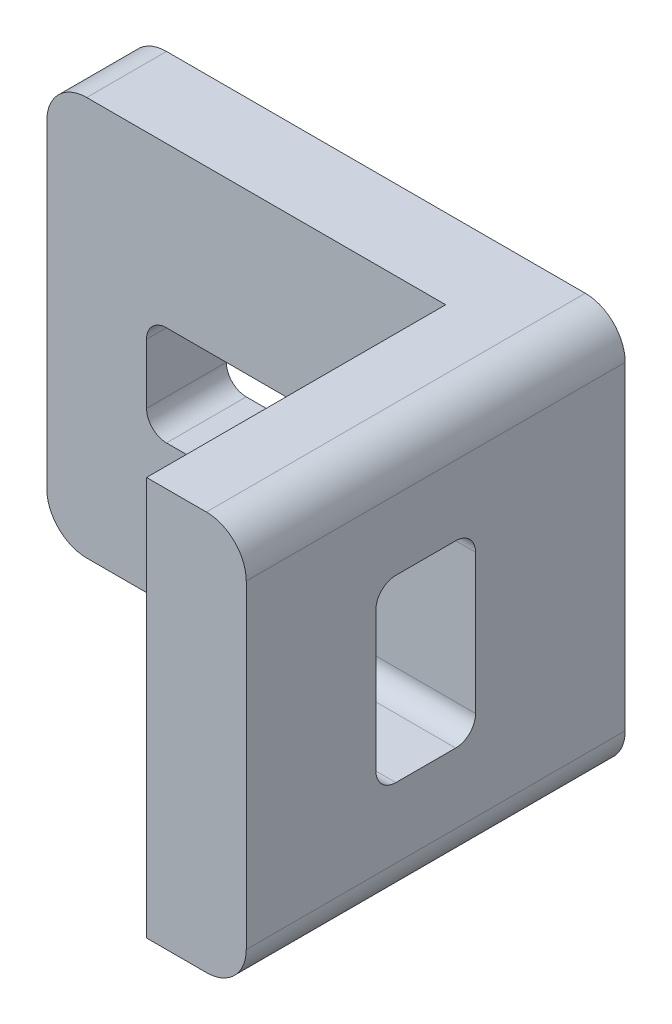
ISO-10303-21;
HEADER;
FILE_DESCRIPTION(('STEP AP214'),'2;1');
FILE_NAME('part.step','',(''),(''),'','','');
FILE_SCHEMA(('AUTOMOTIVE_DESIGN { 1 0 10303 214 1 1 1 1 }'));
ENDSEC;
DATA;
#1=APPLICATION_CONTEXT('core data for automotive mechanical design processes');
#2=APPLICATION_PROTOCOL_DEFINITION('international standard','automotive_design',2000,#1);
#3=PRODUCT_CONTEXT('',#1,'mechanical');
#4=PRODUCT('Part','Part','',(#3));
#5=PRODUCT_RELATED_PRODUCT_CATEGORY('part','',(#4));
#6=PRODUCT_DEFINITION_FORMATION('','',#4);
#7=PRODUCT_DEFINITION_CONTEXT('part definition',#1,'design');
#8=PRODUCT_DEFINITION('design','',#6,#7);
#9=PRODUCT_DEFINITION_SHAPE('','',#8);
#10=(LENGTH_UNIT() NAMED_UNIT(*) SI_UNIT(.MILLI.,.METRE.));
#11=(NAMED_UNIT(*) PLANE_ANGLE_UNIT() SI_UNIT($,.RADIAN.));
#12=(NAMED_UNIT(*) SI_UNIT($,.STERADIAN.) SOLID_ANGLE_UNIT());
#13=UNCERTAINTY_MEASURE_WITH_UNIT(LENGTH_MEASURE(1.E-05),#10,'distance_accuracy_value','');
#14=(GEOMETRIC_REPRESENTATION_CONTEXT(3) GLOBAL_UNCERTAINTY_ASSIGNED_CONTEXT((#13)) GLOBAL_UNIT_ASSIGNED_CONTEXT((#10,
#11,#12)) REPRESENTATION_CONTEXT('',''));
#15=CARTESIAN_POINT('',(0.,0.,0.));
#16=DIRECTION('',(0.,0.,1.));
#17=DIRECTION('',(1.,0.,0.));
#18=AXIS2_PLACEMENT_3D('',#15,#16,#17);
#19=CARTESIAN_POINT('',(9.72672672672673,6.70870870870871,4.));
#20=DIRECTION('',(0.,0.,-1.));
#21=DIRECTION('',(-1.,0.,0.));
#22=AXIS2_PLACEMENT_3D('',#19,#20,#21);
#23=PLANE('',#22);
#24=DIRECTION('',(0.,-1.,0.));
#25=VECTOR('',#24,1.);
#26=CARTESIAN_POINT('',(-8.27327327327327,-0.291291291291291,4.));
#27=LINE('',#26,#25);
#28=CARTESIAN_POINT('',(-8.27327327327327,-0.291291291291291,4.));
#29=VERTEX_POINT('',#28);
#30=CARTESIAN_POINT('',(-8.27327327327327,-3.29129129129129,4.));
#31=VERTEX_POINT('',#30);
#32=EDGE_CURVE('E277',#29,#31,#27,.T.);
#33=ORIENTED_EDGE('',*,*,#32,.F.);
#34=CARTESIAN_POINT('',(-7.27327327327327,-0.291291291291291,4.));
#35=DIRECTION('',(0.,0.,1.));
#36=DIRECTION('',(-1.,0.,0.));
#37=AXIS2_PLACEMENT_3D('',#34,#35,#36);
#38=CIRCLE('',#37,1.);
#39=CARTESIAN_POINT('',(-7.27327327327327,0.708708708708709,4.));
#40=VERTEX_POINT('',#39);
#41=EDGE_CURVE('E275',#40,#29,#38,.T.);
#42=ORIENTED_EDGE('',*,*,#41,.F.);
#43=DIRECTION('',(-1.,0.,0.));
#44=VECTOR('',#43,1.);
#45=CARTESIAN_POINT('',(-7.27327327327327,0.708708708708709,4.));
#46=LINE('',#45,#44);
#47=CARTESIAN_POINT('',(-0.273273273273275,0.708708708708709,4.));
#48=VERTEX_POINT('',#47);
#49=EDGE_CURVE('E295',#48,#40,#46,.T.);
#50=ORIENTED_EDGE('',*,*,#49,.F.);
#51=CARTESIAN_POINT('',(-0.273273273273275,-0.291291291291291,4.));
#52=DIRECTION('',(0.,0.,1.));
#53=DIRECTION('',(1.,0.,0.));
#54=AXIS2_PLACEMENT_3D('',#51,#52,#53);
#55=CIRCLE('',#54,1.);
#56=CARTESIAN_POINT('',(0.726726726726726,-0.291291291291291,4.));
#57=VERTEX_POINT('',#56);
#58=EDGE_CURVE('E292',#57,#48,#55,.T.);
#59=ORIENTED_EDGE('',*,*,#58,.F.);
#60=DIRECTION('',(0.,1.,0.));
#61=VECTOR('',#60,1.);
#62=CARTESIAN_POINT('',(0.726726726726726,-0.291291291291291,4.));
#63=LINE('',#62,#61);
#64=CARTESIAN_POINT('',(0.726726726726727,-3.29129129129129,4.));
#65=VERTEX_POINT('',#64);
#66=EDGE_CURVE('E289',#65,#57,#63,.T.);
#67=ORIENTED_EDGE('',*,*,#66,.F.);
#68=CARTESIAN_POINT('',(-0.273273273273274,-3.29129129129129,4.));
#69=DIRECTION('',(0.,0.,1.));
#70=DIRECTION('',(1.,0.,0.));
#71=AXIS2_PLACEMENT_3D('',#68,#69,#70);
#72=CIRCLE('',#71,1.);
#73=CARTESIAN_POINT('',(-0.273273273273274,-4.29129129129129,4.));
#74=VERTEX_POINT('',#73);
#75=EDGE_CURVE('E286',#74,#65,#72,.T.);
#76=ORIENTED_EDGE('',*,*,#75,.F.);
#77=DIRECTION('',(1.,0.,0.));
#78=VECTOR('',#77,1.);
#79=CARTESIAN_POINT('',(-7.27327327327327,-4.29129129129129,4.));
#80=LINE('',#79,#78);
#81=CARTESIAN_POINT('',(-7.27327327327327,-4.29129129129129,4.));
#82=VERTEX_POINT('',#81);
#83=EDGE_CURVE('E283',#82,#74,#80,.T.);
#84=ORIENTED_EDGE('',*,*,#83,.F.);
#85=CARTESIAN_POINT('',(-7.27327327327327,-3.29129129129129,4.));
#86=DIRECTION('',(0.,0.,1.));
#87=DIRECTION('',(1.,0.,0.));
#88=AXIS2_PLACEMENT_3D('',#85,#86,#87);
#89=CIRCLE('',#88,1.);
#90=EDGE_CURVE('E280',#31,#82,#89,.T.);
#91=ORIENTED_EDGE('',*,*,#90,.F.);
#92=EDGE_LOOP('',(#33,#42,#50,#59,#67,#76,#84,#91));
#93=FACE_BOUND('',#92,.T.);
#94=DIRECTION('',(0.,-1.,0.));
#95=VECTOR('',#94,1.);
#96=CARTESIAN_POINT('',(6.72672672672674,8.70870870870871,4.));
#97=LINE('',#96,#95);
#98=CARTESIAN_POINT('',(6.72672672672674,8.70870870870871,4.));
#99=VERTEX_POINT('',#98);
#100=CARTESIAN_POINT('',(6.72672672672674,-11.2912912912913,4.));
#101=VERTEX_POINT('',#100);
#102=EDGE_CURVE('E301',#99,#101,#97,.T.);
#103=ORIENTED_EDGE('',*,*,#102,.F.);
#104=DIRECTION('',(-1.,0.,0.));
#105=VECTOR('',#104,1.);
#106=CARTESIAN_POINT('',(-11.2732732732733,8.70870870870871,4.));
#107=LINE('',#106,#105);
#108=CARTESIAN_POINT('',(-11.2732732732733,8.70870870870871,4.));
#109=VERTEX_POINT('',#108);
#110=EDGE_CURVE('E342',#99,#109,#107,.T.);
#111=ORIENTED_EDGE('',*,*,#110,.T.);
#112=CARTESIAN_POINT('',(-11.2732732732733,6.70870870870871,4.));
#113=DIRECTION('',(0.,0.,1.));
#114=DIRECTION('',(-1.,0.,0.));
#115=AXIS2_PLACEMENT_3D('',#112,#113,#114);
#116=CIRCLE('',#115,2.);
#117=CARTESIAN_POINT('',(-13.2732732732733,6.7087087087087,4.));
#118=VERTEX_POINT('',#117);
#119=EDGE_CURVE('E344',#109,#118,#116,.T.);
#120=ORIENTED_EDGE('',*,*,#119,.T.);
#121=DIRECTION('',(0.,-1.,0.));
#122=VECTOR('',#121,1.);
#123=CARTESIAN_POINT('',(-13.2732732732733,6.7087087087087,4.));
#124=LINE('',#123,#122);
#125=CARTESIAN_POINT('',(-13.2732732732733,-9.29129129129128,4.));
#126=VERTEX_POINT('',#125);
#127=EDGE_CURVE('E347',#118,#126,#124,.T.);
#128=ORIENTED_EDGE('',*,*,#127,.T.);
#129=CARTESIAN_POINT('',(-11.2732732732733,-9.29129129129129,4.));
#130=DIRECTION('',(0.,0.,1.));
#131=DIRECTION('',(-1.,0.,0.));
#132=AXIS2_PLACEMENT_3D('',#129,#130,#131);
#133=CIRCLE('',#132,2.);
#134=CARTESIAN_POINT('',(-11.2732732732733,-11.2912912912913,4.));
#135=VERTEX_POINT('',#134);
#136=EDGE_CURVE('E349',#126,#135,#133,.T.);
#137=ORIENTED_EDGE('',*,*,#136,.T.);
#138=DIRECTION('',(1.,0.,0.));
#139=VECTOR('',#138,1.);
#140=CARTESIAN_POINT('',(-11.2732732732733,-11.2912912912913,4.));
#141=LINE('',#140,#139);
#142=EDGE_CURVE('E351',#135,#101,#141,.T.);
#143=ORIENTED_EDGE('',*,*,#142,.T.);
#144=EDGE_LOOP('',(#103,#111,#120,#128,#137,#143));
#145=FACE_BOUND('',#144,.T.);
#146=ADVANCED_FACE('F33',(#93,#145),#23,.F.);
#147=CARTESIAN_POINT('',(9.72672672672673,6.70870870870871,4.));
#148=DIRECTION('',(0.,0.,-1.));
#149=DIRECTION('',(-1.,0.,0.));
#150=AXIS2_PLACEMENT_3D('',#147,#148,#149);
#151=CYLINDRICAL_SURFACE('',#150,2.);
#152=CARTESIAN_POINT('',(9.72672672672673,6.70870870870871,0.));
#153=DIRECTION('',(0.,0.,1.));
#154=DIRECTION('',(-1.,0.,0.));
#155=AXIS2_PLACEMENT_3D('',#152,#153,#154);
#156=CIRCLE('',#155,2.);
#157=CARTESIAN_POINT('',(11.7267267267267,6.70870870870871,0.));
#158=VERTEX_POINT('',#157);
#159=CARTESIAN_POINT('',(9.72672672672673,8.70870870870871,0.));
#160=VERTEX_POINT('',#159);
#161=EDGE_CURVE('E341',#158,#160,#156,.T.);
#162=ORIENTED_EDGE('',*,*,#161,.T.);
#163=DIRECTION('',(0.,0.,-1.));
#164=VECTOR('',#163,1.);
#165=CARTESIAN_POINT('',(9.72672672672673,8.70870870870871,4.));
#166=LINE('',#165,#164);
#167=CARTESIAN_POINT('',(9.72672672672673,8.70870870870871,19.));
#168=VERTEX_POINT('',#167);
#169=EDGE_CURVE('E389',#168,#160,#166,.T.);
#170=ORIENTED_EDGE('',*,*,#169,.F.);
#171=CARTESIAN_POINT('',(9.72672672672673,6.70870870870871,19.));
#172=DIRECTION('',(0.,0.,1.));
#173=DIRECTION('',(-1.,0.,0.));
#174=AXIS2_PLACEMENT_3D('',#171,#172,#173);
#175=CIRCLE('',#174,2.);
#176=CARTESIAN_POINT('',(11.7267267267267,6.70870870870871,19.));
#177=VERTEX_POINT('',#176);
#178=EDGE_CURVE('E328',#177,#168,#175,.T.);
#179=ORIENTED_EDGE('',*,*,#178,.F.);
#180=DIRECTION('',(0.,0.,-1.));
#181=VECTOR('',#180,1.);
#182=CARTESIAN_POINT('',(11.7267267267267,6.70870870870871,4.));
#183=LINE('',#182,#181);
#184=EDGE_CURVE('E353',#177,#158,#183,.T.);
#185=ORIENTED_EDGE('',*,*,#184,.T.);
#186=EDGE_LOOP('',(#162,#170,#179,#185));
#187=FACE_BOUND('',#186,.T.);
#188=ADVANCED_FACE('F35',(#187),#151,.T.);
#189=CARTESIAN_POINT('',(-11.2732732732733,8.70870870870871,4.));
#190=DIRECTION('',(0.,-1.,0.));
#191=DIRECTION('',(0.,0.,-1.));
#192=AXIS2_PLACEMENT_3D('',#189,#190,#191);
#193=PLANE('',#192);
#194=DIRECTION('',(-1.,0.,0.));
#195=VECTOR('',#194,1.);
#196=CARTESIAN_POINT('',(-11.2732732732733,8.70870870870871,0.));
#197=LINE('',#196,#195);
#198=CARTESIAN_POINT('',(-11.2732732732733,8.70870870870871,0.));
#199=VERTEX_POINT('',#198);
#200=EDGE_CURVE('E356',#160,#199,#197,.T.);
#201=ORIENTED_EDGE('',*,*,#200,.T.);
#202=DIRECTION('',(0.,0.,-1.));
#203=VECTOR('',#202,1.);
#204=CARTESIAN_POINT('',(-11.2732732732733,8.70870870870871,4.));
#205=LINE('',#204,#203);
#206=EDGE_CURVE('E386',#109,#199,#205,.T.);
#207=ORIENTED_EDGE('',*,*,#206,.F.);
#208=ORIENTED_EDGE('',*,*,#110,.F.);
#209=DIRECTION('',(0.,0.,-1.));
#210=VECTOR('',#209,1.);
#211=CARTESIAN_POINT('',(6.72672672672674,8.70870870870871,19.));
#212=LINE('',#211,#210);
#213=CARTESIAN_POINT('',(6.72672672672674,8.70870870870871,19.));
#214=VERTEX_POINT('',#213);
#215=EDGE_CURVE('E333',#214,#99,#212,.T.);
#216=ORIENTED_EDGE('',*,*,#215,.F.);
#217=DIRECTION('',(-1.,0.,0.));
#218=VECTOR('',#217,1.);
#219=CARTESIAN_POINT('',(6.72672672672674,8.70870870870871,19.));
#220=LINE('',#219,#218);
#221=EDGE_CURVE('E331',#168,#214,#220,.T.);
#222=ORIENTED_EDGE('',*,*,#221,.F.);
#223=ORIENTED_EDGE('',*,*,#169,.T.);
#224=EDGE_LOOP('',(#201,#207,#208,#216,#222,#223));
#225=FACE_BOUND('',#224,.T.);
#226=ADVANCED_FACE('F461',(#225),#193,.F.);
#227=CARTESIAN_POINT('',(-11.2732732732733,6.70870870870871,4.));
#228=DIRECTION('',(0.,0.,-1.));
#229=DIRECTION('',(-1.,0.,0.));
#230=AXIS2_PLACEMENT_3D('',#227,#228,#229);
#231=CYLINDRICAL_SURFACE('',#230,2.);
#232=CARTESIAN_POINT('',(-11.2732732732733,6.70870870870871,0.));
#233=DIRECTION('',(0.,0.,1.));
#234=DIRECTION('',(-1.,0.,0.));
#235=AXIS2_PLACEMENT_3D('',#232,#233,#234);
#236=CIRCLE('',#235,2.);
#237=CARTESIAN_POINT('',(-13.2732732732733,6.7087087087087,0.));
#238=VERTEX_POINT('',#237);
#239=EDGE_CURVE('E358',#199,#238,#236,.T.);
#240=ORIENTED_EDGE('',*,*,#239,.T.);
#241=DIRECTION('',(0.,0.,-1.));
#242=VECTOR('',#241,1.);
#243=CARTESIAN_POINT('',(-13.2732732732733,6.7087087087087,4.));
#244=LINE('',#243,#242);
#245=EDGE_CURVE('E383',#118,#238,#244,.T.);
#246=ORIENTED_EDGE('',*,*,#245,.F.);
#247=ORIENTED_EDGE('',*,*,#119,.F.);
#248=ORIENTED_EDGE('',*,*,#206,.T.);
#249=EDGE_LOOP('',(#240,#246,#247,#248));
#250=FACE_BOUND('',#249,.T.);
#251=ADVANCED_FACE('F487',(#250),#231,.T.);
#252=CARTESIAN_POINT('',(-13.2732732732733,6.7087087087087,4.));
#253=DIRECTION('',(1.,0.,0.));
#254=DIRECTION('',(0.,0.,-1.));
#255=AXIS2_PLACEMENT_3D('',#252,#253,#254);
#256=PLANE('',#255);
#257=DIRECTION('',(0.,-1.,0.));
#258=VECTOR('',#257,1.);
#259=CARTESIAN_POINT('',(-13.2732732732733,6.7087087087087,0.));
#260=LINE('',#259,#258);
#261=CARTESIAN_POINT('',(-13.2732732732733,-9.29129129129128,0.));
#262=VERTEX_POINT('',#261);
#263=EDGE_CURVE('E360',#238,#262,#260,.T.);
#264=ORIENTED_EDGE('',*,*,#263,.T.);
#265=DIRECTION('',(0.,0.,-1.));
#266=VECTOR('',#265,1.);
#267=CARTESIAN_POINT('',(-13.2732732732733,-9.29129129129128,4.));
#268=LINE('',#267,#266);
#269=EDGE_CURVE('E380',#126,#262,#268,.T.);
#270=ORIENTED_EDGE('',*,*,#269,.F.);
#271=ORIENTED_EDGE('',*,*,#127,.F.);
#272=ORIENTED_EDGE('',*,*,#245,.T.);
#273=EDGE_LOOP('',(#264,#270,#271,#272));
#274=FACE_BOUND('',#273,.T.);
#275=ADVANCED_FACE('F483',(#274),#256,.F.);
#276=CARTESIAN_POINT('',(-11.2732732732733,-9.29129129129129,4.));
#277=DIRECTION('',(0.,0.,-1.));
#278=DIRECTION('',(-1.,0.,0.));
#279=AXIS2_PLACEMENT_3D('',#276,#277,#278);
#280=CYLINDRICAL_SURFACE('',#279,2.);
#281=CARTESIAN_POINT('',(-11.2732732732733,-9.29129129129129,0.));
#282=DIRECTION('',(0.,0.,1.));
#283=DIRECTION('',(-1.,0.,0.));
#284=AXIS2_PLACEMENT_3D('',#281,#282,#283);
#285=CIRCLE('',#284,2.);
#286=CARTESIAN_POINT('',(-11.2732732732733,-11.2912912912913,0.));
#287=VERTEX_POINT('',#286);
#288=EDGE_CURVE('E362',#262,#287,#285,.T.);
#289=ORIENTED_EDGE('',*,*,#288,.T.);
#290=DIRECTION('',(0.,0.,-1.));
#291=VECTOR('',#290,1.);
#292=CARTESIAN_POINT('',(-11.2732732732733,-11.2912912912913,4.));
#293=LINE('',#292,#291);
#294=EDGE_CURVE('E377',#135,#287,#293,.T.);
#295=ORIENTED_EDGE('',*,*,#294,.F.);
#296=ORIENTED_EDGE('',*,*,#136,.F.);
#297=ORIENTED_EDGE('',*,*,#269,.T.);
#298=EDGE_LOOP('',(#289,#295,#296,#297));
#299=FACE_BOUND('',#298,.T.);
#300=ADVANCED_FACE('F479',(#299),#280,.T.);
#301=CARTESIAN_POINT('',(-11.2732732732733,-11.2912912912913,4.));
#302=DIRECTION('',(0.,1.,0.));
#303=DIRECTION('',(0.,0.,1.));
#304=AXIS2_PLACEMENT_3D('',#301,#302,#303);
#305=PLANE('',#304);
#306=DIRECTION('',(1.,0.,0.));
#307=VECTOR('',#306,1.);
#308=CARTESIAN_POINT('',(-11.2732732732733,-11.2912912912913,0.));
#309=LINE('',#308,#307);
#310=CARTESIAN_POINT('',(9.72672672672673,-11.2912912912913,0.));
#311=VERTEX_POINT('',#310);
#312=EDGE_CURVE('E364',#287,#311,#309,.T.);
#313=ORIENTED_EDGE('',*,*,#312,.T.);
#314=DIRECTION('',(0.,0.,-1.));
#315=VECTOR('',#314,1.);
#316=CARTESIAN_POINT('',(9.72672672672673,-11.2912912912913,4.));
#317=LINE('',#316,#315);
#318=CARTESIAN_POINT('',(9.72672672672673,-11.2912912912913,19.));
#319=VERTEX_POINT('',#318);
#320=EDGE_CURVE('E374',#319,#311,#317,.T.);
#321=ORIENTED_EDGE('',*,*,#320,.F.);
#322=DIRECTION('',(1.,0.,0.));
#323=VECTOR('',#322,1.);
#324=CARTESIAN_POINT('',(6.72672672672674,-11.2912912912913,19.));
#325=LINE('',#324,#323);
#326=CARTESIAN_POINT('',(6.72672672672674,-11.2912912912913,19.));
#327=VERTEX_POINT('',#326);
#328=EDGE_CURVE('E319',#327,#319,#325,.T.);
#329=ORIENTED_EDGE('',*,*,#328,.F.);
#330=DIRECTION('',(0.,0.,-1.));
#331=VECTOR('',#330,1.);
#332=CARTESIAN_POINT('',(6.72672672672674,-11.2912912912913,19.));
#333=LINE('',#332,#331);
#334=EDGE_CURVE('E338',#327,#101,#333,.T.);
#335=ORIENTED_EDGE('',*,*,#334,.T.);
#336=ORIENTED_EDGE('',*,*,#142,.F.);
#337=ORIENTED_EDGE('',*,*,#294,.T.);
#338=EDGE_LOOP('',(#313,#321,#329,#335,#336,#337));
#339=FACE_BOUND('',#338,.T.);
#340=ADVANCED_FACE('F475',(#339),#305,.F.);
#341=CARTESIAN_POINT('',(9.72672672672673,-9.29129129129129,4.));
#342=DIRECTION('',(0.,0.,-1.));
#343=DIRECTION('',(-1.,0.,0.));
#344=AXIS2_PLACEMENT_3D('',#341,#342,#343);
#345=CYLINDRICAL_SURFACE('',#344,2.);
#346=CARTESIAN_POINT('',(9.72672672672673,-9.29129129129129,0.));
#347=DIRECTION('',(0.,0.,1.));
#348=DIRECTION('',(-1.,0.,0.));
#349=AXIS2_PLACEMENT_3D('',#346,#347,#348);
#350=CIRCLE('',#349,2.);
#351=CARTESIAN_POINT('',(11.7267267267267,-9.29129129129129,0.));
#352=VERTEX_POINT('',#351);
#353=EDGE_CURVE('E366',#311,#352,#350,.T.);
#354=ORIENTED_EDGE('',*,*,#353,.T.);
#355=DIRECTION('',(0.,0.,-1.));
#356=VECTOR('',#355,1.);
#357=CARTESIAN_POINT('',(11.7267267267267,-9.29129129129129,4.));
#358=LINE('',#357,#356);
#359=CARTESIAN_POINT('',(11.7267267267267,-9.29129129129129,19.));
#360=VERTEX_POINT('',#359);
#361=EDGE_CURVE('E371',#360,#352,#358,.T.);
#362=ORIENTED_EDGE('',*,*,#361,.F.);
#363=CARTESIAN_POINT('',(9.72672672672673,-9.29129129129129,19.));
#364=DIRECTION('',(0.,0.,1.));
#365=DIRECTION('',(-1.,0.,0.));
#366=AXIS2_PLACEMENT_3D('',#363,#364,#365);
#367=CIRCLE('',#366,2.);
#368=EDGE_CURVE('E322',#319,#360,#367,.T.);
#369=ORIENTED_EDGE('',*,*,#368,.F.);
#370=ORIENTED_EDGE('',*,*,#320,.T.);
#371=EDGE_LOOP('',(#354,#362,#369,#370));
#372=FACE_BOUND('',#371,.T.);
#373=ADVANCED_FACE('F471',(#372),#345,.T.);
#374=CARTESIAN_POINT('',(11.7267267267267,6.70870870870871,4.));
#375=DIRECTION('',(-1.,0.,0.));
#376=DIRECTION('',(0.,-1.,0.));
#377=AXIS2_PLACEMENT_3D('',#374,#375,#376);
#378=PLANE('',#377);
#379=DIRECTION('',(0.,0.,-1.));
#380=VECTOR('',#379,1.);
#381=CARTESIAN_POINT('',(11.7267267267267,3.20870870870871,4.));
#382=LINE('',#381,#380);
#383=CARTESIAN_POINT('',(11.7267267267267,3.20870870870871,11.5));
#384=VERTEX_POINT('',#383);
#385=CARTESIAN_POINT('',(11.7267267267267,3.20870870870871,8.5));
#386=VERTEX_POINT('',#385);
#387=EDGE_CURVE('E269',#384,#386,#382,.T.);
#388=ORIENTED_EDGE('',*,*,#387,.T.);
#389=CARTESIAN_POINT('',(11.7267267267267,2.20870870870871,8.5));
#390=DIRECTION('',(-1.,0.,0.));
#391=DIRECTION('',(0.,-1.,0.));
#392=AXIS2_PLACEMENT_3D('',#389,#390,#391);
#393=CIRCLE('',#392,0.999999999999997);
#394=CARTESIAN_POINT('',(11.7267267267267,2.20870870870871,7.5));
#395=VERTEX_POINT('',#394);
#396=EDGE_CURVE('E272',#386,#395,#393,.T.);
#397=ORIENTED_EDGE('',*,*,#396,.T.);
#398=DIRECTION('',(0.,-1.,0.));
#399=VECTOR('',#398,1.);
#400=CARTESIAN_POINT('',(11.7267267267267,6.70870870870871,7.5));
#401=LINE('',#400,#399);
#402=CARTESIAN_POINT('',(11.7267267267267,-4.79129129129129,7.5));
#403=VERTEX_POINT('',#402);
#404=EDGE_CURVE('E244',#395,#403,#401,.T.);
#405=ORIENTED_EDGE('',*,*,#404,.T.);
#406=CARTESIAN_POINT('',(11.7267267267267,-4.79129129129129,8.5));
#407=DIRECTION('',(-1.,0.,0.));
#408=DIRECTION('',(0.,-1.,0.));
#409=AXIS2_PLACEMENT_3D('',#406,#407,#408);
#410=CIRCLE('',#409,0.999999999999997);
#411=CARTESIAN_POINT('',(11.7267267267267,-5.79129129129129,8.5));
#412=VERTEX_POINT('',#411);
#413=EDGE_CURVE('E211',#403,#412,#410,.T.);
#414=ORIENTED_EDGE('',*,*,#413,.T.);
#415=DIRECTION('',(0.,0.,1.));
#416=VECTOR('',#415,1.);
#417=CARTESIAN_POINT('',(11.7267267267267,-5.79129129129129,4.));
#418=LINE('',#417,#416);
#419=CARTESIAN_POINT('',(11.7267267267267,-5.79129129129129,11.5));
#420=VERTEX_POINT('',#419);
#421=EDGE_CURVE('E257',#412,#420,#418,.T.);
#422=ORIENTED_EDGE('',*,*,#421,.T.);
#423=CARTESIAN_POINT('',(11.7267267267267,-4.79129129129129,11.5));
#424=DIRECTION('',(-1.,0.,0.));
#425=DIRECTION('',(0.,-1.,0.));
#426=AXIS2_PLACEMENT_3D('',#423,#424,#425);
#427=CIRCLE('',#426,0.999999999999997);
#428=CARTESIAN_POINT('',(11.7267267267267,-4.79129129129129,12.5));
#429=VERTEX_POINT('',#428);
#430=EDGE_CURVE('E260',#420,#429,#427,.T.);
#431=ORIENTED_EDGE('',*,*,#430,.T.);
#432=DIRECTION('',(0.,1.,0.));
#433=VECTOR('',#432,1.);
#434=CARTESIAN_POINT('',(11.7267267267267,6.70870870870871,12.5));
#435=LINE('',#434,#433);
#436=CARTESIAN_POINT('',(11.7267267267267,2.20870870870871,12.5));
#437=VERTEX_POINT('',#436);
#438=EDGE_CURVE('E263',#429,#437,#435,.T.);
#439=ORIENTED_EDGE('',*,*,#438,.T.);
#440=CARTESIAN_POINT('',(11.7267267267267,2.20870870870871,11.5));
#441=DIRECTION('',(-1.,0.,0.));
#442=DIRECTION('',(0.,-1.,0.));
#443=AXIS2_PLACEMENT_3D('',#440,#441,#442);
#444=CIRCLE('',#443,0.999999999999997);
#445=EDGE_CURVE('E266',#437,#384,#444,.T.);
#446=ORIENTED_EDGE('',*,*,#445,.T.);
#447=EDGE_LOOP('',(#388,#397,#405,#414,#422,#431,#439,#446));
#448=FACE_BOUND('',#447,.T.);
#449=DIRECTION('',(0.,1.,0.));
#450=VECTOR('',#449,1.);
#451=CARTESIAN_POINT('',(11.7267267267267,6.70870870870871,0.));
#452=LINE('',#451,#450);
#453=EDGE_CURVE('E345',#352,#158,#452,.T.);
#454=ORIENTED_EDGE('',*,*,#453,.T.);
#455=ORIENTED_EDGE('',*,*,#184,.F.);
#456=DIRECTION('',(0.,1.,0.));
#457=VECTOR('',#456,1.);
#458=CARTESIAN_POINT('',(11.7267267267267,6.70870870870871,19.));
#459=LINE('',#458,#457);
#460=EDGE_CURVE('E325',#360,#177,#459,.T.);
#461=ORIENTED_EDGE('',*,*,#460,.F.);
#462=ORIENTED_EDGE('',*,*,#361,.T.);
#463=EDGE_LOOP('',(#454,#455,#461,#462));
#464=FACE_BOUND('',#463,.T.);
#465=ADVANCED_FACE('F468',(#448,#464),#378,.F.);
#466=CARTESIAN_POINT('',(9.72672672672673,6.70870870870871,0.));
#467=DIRECTION('',(0.,0.,-1.));
#468=DIRECTION('',(-1.,0.,0.));
#469=AXIS2_PLACEMENT_3D('',#466,#467,#468);
#470=PLANE('',#469);
#471=CARTESIAN_POINT('',(-7.27327327327327,-0.291291291291291,0.));
#472=DIRECTION('',(0.,0.,-1.));
#473=DIRECTION('',(-1.,0.,0.));
#474=AXIS2_PLACEMENT_3D('',#471,#472,#473);
#475=CIRCLE('',#474,1.);
#476=CARTESIAN_POINT('',(-8.27327327327327,-0.291291291291291,0.));
#477=VERTEX_POINT('',#476);
#478=CARTESIAN_POINT('',(-7.27327327327327,0.708708708708709,0.));
#479=VERTEX_POINT('',#478);
#480=EDGE_CURVE('E11',#477,#479,#475,.T.);
#481=ORIENTED_EDGE('',*,*,#480,.F.);
#482=DIRECTION('',(0.,1.,0.));
#483=VECTOR('',#482,1.);
#484=CARTESIAN_POINT('',(-8.27327327327327,6.70870870870871,0.));
#485=LINE('',#484,#483);
#486=CARTESIAN_POINT('',(-8.27327327327327,-3.29129129129129,0.));
#487=VERTEX_POINT('',#486);
#488=EDGE_CURVE('E392',#487,#477,#485,.T.);
#489=ORIENTED_EDGE('',*,*,#488,.F.);
#490=CARTESIAN_POINT('',(-7.27327327327327,-3.29129129129129,0.));
#491=DIRECTION('',(0.,0.,-1.));
#492=DIRECTION('',(-1.,0.,0.));
#493=AXIS2_PLACEMENT_3D('',#490,#491,#492);
#494=CIRCLE('',#493,1.);
#495=CARTESIAN_POINT('',(-7.27327327327327,-4.29129129129129,0.));
#496=VERTEX_POINT('',#495);
#497=EDGE_CURVE('E394',#496,#487,#494,.T.);
#498=ORIENTED_EDGE('',*,*,#497,.F.);
#499=DIRECTION('',(-1.,0.,0.));
#500=VECTOR('',#499,1.);
#501=CARTESIAN_POINT('',(9.72672672672673,-4.29129129129129,0.));
#502=LINE('',#501,#500);
#503=CARTESIAN_POINT('',(-0.273273273273274,-4.29129129129129,0.));
#504=VERTEX_POINT('',#503);
#505=EDGE_CURVE('E397',#504,#496,#502,.T.);
#506=ORIENTED_EDGE('',*,*,#505,.F.);
#507=CARTESIAN_POINT('',(-0.273273273273274,-3.29129129129129,0.));
#508=DIRECTION('',(0.,0.,-1.));
#509=DIRECTION('',(-1.,0.,0.));
#510=AXIS2_PLACEMENT_3D('',#507,#508,#509);
#511=CIRCLE('',#510,1.);
#512=CARTESIAN_POINT('',(0.726726726726727,-3.29129129129129,0.));
#513=VERTEX_POINT('',#512);
#514=EDGE_CURVE('E399',#513,#504,#511,.T.);
#515=ORIENTED_EDGE('',*,*,#514,.F.);
#516=DIRECTION('',(0.,-1.,0.));
#517=VECTOR('',#516,1.);
#518=CARTESIAN_POINT('',(0.726726726726724,6.70870870870871,0.));
#519=LINE('',#518,#517);
#520=CARTESIAN_POINT('',(0.726726726726726,-0.291291291291291,0.));
#521=VERTEX_POINT('',#520);
#522=EDGE_CURVE('E401',#521,#513,#519,.T.);
#523=ORIENTED_EDGE('',*,*,#522,.F.);
#524=CARTESIAN_POINT('',(-0.273273273273275,-0.291291291291291,0.));
#525=DIRECTION('',(0.,0.,-1.));
#526=DIRECTION('',(-1.,0.,0.));
#527=AXIS2_PLACEMENT_3D('',#524,#525,#526);
#528=CIRCLE('',#527,1.);
#529=CARTESIAN_POINT('',(-0.273273273273275,0.708708708708709,0.));
#530=VERTEX_POINT('',#529);
#531=EDGE_CURVE('E403',#530,#521,#528,.T.);
#532=ORIENTED_EDGE('',*,*,#531,.F.);
#533=DIRECTION('',(1.,0.,0.));
#534=VECTOR('',#533,1.);
#535=CARTESIAN_POINT('',(9.72672672672673,0.708708708708709,0.));
#536=LINE('',#535,#534);
#537=EDGE_CURVE('E41',#479,#530,#536,.T.);
#538=ORIENTED_EDGE('',*,*,#537,.F.);
#539=EDGE_LOOP('',(#481,#489,#498,#506,#515,#523,#532,#538));
#540=FACE_BOUND('',#539,.T.);
#541=ORIENTED_EDGE('',*,*,#161,.F.);
#542=ORIENTED_EDGE('',*,*,#453,.F.);
#543=ORIENTED_EDGE('',*,*,#353,.F.);
#544=ORIENTED_EDGE('',*,*,#312,.F.);
#545=ORIENTED_EDGE('',*,*,#288,.F.);
#546=ORIENTED_EDGE('',*,*,#263,.F.);
#547=ORIENTED_EDGE('',*,*,#239,.F.);
#548=ORIENTED_EDGE('',*,*,#200,.F.);
#549=EDGE_LOOP('',(#541,#542,#543,#544,#545,#546,#547,#548));
#550=FACE_BOUND('',#549,.T.);
#551=ADVANCED_FACE('F418',(#540,#550),#470,.T.);
#552=CARTESIAN_POINT('',(6.72672672672674,8.70870870870871,19.));
#553=DIRECTION('',(1.,0.,0.));
#554=DIRECTION('',(0.,0.,-1.));
#555=AXIS2_PLACEMENT_3D('',#552,#553,#554);
#556=PLANE('',#555);
#557=DIRECTION('',(0.,-1.,0.));
#558=VECTOR('',#557,1.);
#559=CARTESIAN_POINT('',(6.72672672672674,2.20870870870871,7.5));
#560=LINE('',#559,#558);
#561=CARTESIAN_POINT('',(6.72672672672674,2.20870870870871,7.5));
#562=VERTEX_POINT('',#561);
#563=CARTESIAN_POINT('',(6.72672672672674,-4.79129129129129,7.5));
#564=VERTEX_POINT('',#563);
#565=EDGE_CURVE('E217',#562,#564,#560,.T.);
#566=ORIENTED_EDGE('',*,*,#565,.F.);
#567=CARTESIAN_POINT('',(6.72672672672674,2.20870870870871,8.5));
#568=DIRECTION('',(-1.,0.,0.));
#569=DIRECTION('',(0.,0.,-1.));
#570=AXIS2_PLACEMENT_3D('',#567,#568,#569);
#571=CIRCLE('',#570,0.999999999999997);
#572=CARTESIAN_POINT('',(6.72672672672674,3.20870870870871,8.5));
#573=VERTEX_POINT('',#572);
#574=EDGE_CURVE('E56',#573,#562,#571,.T.);
#575=ORIENTED_EDGE('',*,*,#574,.F.);
#576=DIRECTION('',(0.,0.,-1.));
#577=VECTOR('',#576,1.);
#578=CARTESIAN_POINT('',(6.72672672672674,3.20870870870871,8.5));
#579=LINE('',#578,#577);
#580=CARTESIAN_POINT('',(6.72672672672674,3.20870870870871,11.5));
#581=VERTEX_POINT('',#580);
#582=EDGE_CURVE('E239',#581,#573,#579,.T.);
#583=ORIENTED_EDGE('',*,*,#582,.F.);
#584=CARTESIAN_POINT('',(6.72672672672674,2.20870870870871,11.5));
#585=DIRECTION('',(-1.,0.,0.));
#586=DIRECTION('',(0.,0.,1.));
#587=AXIS2_PLACEMENT_3D('',#584,#585,#586);
#588=CIRCLE('',#587,0.999999999999997);
#589=CARTESIAN_POINT('',(6.72672672672674,2.20870870870871,12.5));
#590=VERTEX_POINT('',#589);
#591=EDGE_CURVE('E236',#590,#581,#588,.T.);
#592=ORIENTED_EDGE('',*,*,#591,.F.);
#593=DIRECTION('',(0.,1.,0.));
#594=VECTOR('',#593,1.);
#595=CARTESIAN_POINT('',(6.72672672672674,2.20870870870871,12.5));
#596=LINE('',#595,#594);
#597=CARTESIAN_POINT('',(6.72672672672674,-4.79129129129129,12.5));
#598=VERTEX_POINT('',#597);
#599=EDGE_CURVE('E233',#598,#590,#596,.T.);
#600=ORIENTED_EDGE('',*,*,#599,.F.);
#601=CARTESIAN_POINT('',(6.72672672672674,-4.79129129129129,11.5));
#602=DIRECTION('',(-1.,0.,0.));
#603=DIRECTION('',(0.,0.,1.));
#604=AXIS2_PLACEMENT_3D('',#601,#602,#603);
#605=CIRCLE('',#604,0.999999999999997);
#606=CARTESIAN_POINT('',(6.72672672672674,-5.79129129129129,11.5));
#607=VERTEX_POINT('',#606);
#608=EDGE_CURVE('E227',#607,#598,#605,.T.);
#609=ORIENTED_EDGE('',*,*,#608,.F.);
#610=DIRECTION('',(0.,0.,1.));
#611=VECTOR('',#610,1.);
#612=CARTESIAN_POINT('',(6.72672672672674,-5.79129129129129,8.5));
#613=LINE('',#612,#611);
#614=CARTESIAN_POINT('',(6.72672672672674,-5.79129129129129,8.5));
#615=VERTEX_POINT('',#614);
#616=EDGE_CURVE('E225',#615,#607,#613,.T.);
#617=ORIENTED_EDGE('',*,*,#616,.F.);
#618=CARTESIAN_POINT('',(6.72672672672674,-4.79129129129129,8.5));
#619=DIRECTION('',(-1.,0.,0.));
#620=DIRECTION('',(0.,0.,1.));
#621=AXIS2_PLACEMENT_3D('',#618,#619,#620);
#622=CIRCLE('',#621,0.999999999999997);
#623=EDGE_CURVE('E208',#564,#615,#622,.T.);
#624=ORIENTED_EDGE('',*,*,#623,.F.);
#625=EDGE_LOOP('',(#566,#575,#583,#592,#600,#609,#617,#624));
#626=FACE_BOUND('',#625,.T.);
#627=ORIENTED_EDGE('',*,*,#102,.T.);
#628=ORIENTED_EDGE('',*,*,#334,.F.);
#629=DIRECTION('',(0.,-1.,0.));
#630=VECTOR('',#629,1.);
#631=CARTESIAN_POINT('',(6.72672672672674,8.70870870870871,19.));
#632=LINE('',#631,#630);
#633=EDGE_CURVE('E316',#214,#327,#632,.T.);
#634=ORIENTED_EDGE('',*,*,#633,.F.);
#635=ORIENTED_EDGE('',*,*,#215,.T.);
#636=EDGE_LOOP('',(#627,#628,#634,#635));
#637=FACE_BOUND('',#636,.T.);
#638=ADVANCED_FACE('F221',(#626,#637),#556,.F.);
#639=CARTESIAN_POINT('',(9.72672672672673,-9.29129129129129,19.));
#640=DIRECTION('',(0.,0.,-1.));
#641=DIRECTION('',(-1.,0.,0.));
#642=AXIS2_PLACEMENT_3D('',#639,#640,#641);
#643=PLANE('',#642);
#644=ORIENTED_EDGE('',*,*,#633,.T.);
#645=ORIENTED_EDGE('',*,*,#328,.T.);
#646=ORIENTED_EDGE('',*,*,#368,.T.);
#647=ORIENTED_EDGE('',*,*,#460,.T.);
#648=ORIENTED_EDGE('',*,*,#178,.T.);
#649=ORIENTED_EDGE('',*,*,#221,.T.);
#650=EDGE_LOOP('',(#644,#645,#646,#647,#648,#649));
#651=FACE_BOUND('',#650,.T.);
#652=ADVANCED_FACE('F514',(#651),#643,.F.);
#653=CARTESIAN_POINT('',(-7.27327327327327,-0.291291291291291,-46.));
#654=DIRECTION('',(0.,0.,1.));
#655=DIRECTION('',(1.,0.,0.));
#656=AXIS2_PLACEMENT_3D('',#653,#654,#655);
#657=CYLINDRICAL_SURFACE('',#656,1.);
#658=ORIENTED_EDGE('',*,*,#480,.T.);
#659=DIRECTION('',(0.,0.,1.));
#660=VECTOR('',#659,1.);
#661=CARTESIAN_POINT('',(-7.27327327327327,0.708708708708709,-46.));
#662=LINE('',#661,#660);
#663=EDGE_CURVE('E299',#479,#40,#662,.T.);
#664=ORIENTED_EDGE('',*,*,#663,.T.);
#665=ORIENTED_EDGE('',*,*,#41,.T.);
#666=DIRECTION('',(0.,0.,1.));
#667=VECTOR('',#666,1.);
#668=CARTESIAN_POINT('',(-8.27327327327327,-0.291291291291291,-46.));
#669=LINE('',#668,#667);
#670=EDGE_CURVE('E298',#477,#29,#669,.T.);
#671=ORIENTED_EDGE('',*,*,#670,.F.);
#672=EDGE_LOOP('',(#658,#664,#665,#671));
#673=FACE_BOUND('',#672,.T.);
#674=ADVANCED_FACE('F438',(#673),#657,.F.);
#675=CARTESIAN_POINT('',(-7.27327327327327,0.708708708708709,-46.));
#676=DIRECTION('',(0.,1.,0.));
#677=DIRECTION('',(0.,0.,1.));
#678=AXIS2_PLACEMENT_3D('',#675,#676,#677);
#679=PLANE('',#678);
#680=ORIENTED_EDGE('',*,*,#537,.T.);
#681=DIRECTION('',(0.,0.,1.));
#682=VECTOR('',#681,1.);
#683=CARTESIAN_POINT('',(-0.273273273273275,0.708708708708709,-46.));
#684=LINE('',#683,#682);
#685=EDGE_CURVE('E302',#530,#48,#684,.T.);
#686=ORIENTED_EDGE('',*,*,#685,.T.);
#687=ORIENTED_EDGE('',*,*,#49,.T.);
#688=ORIENTED_EDGE('',*,*,#663,.F.);
#689=EDGE_LOOP('',(#680,#686,#687,#688));
#690=FACE_BOUND('',#689,.T.);
#691=ADVANCED_FACE('F408',(#690),#679,.F.);
#692=CARTESIAN_POINT('',(-0.273273273273275,-0.291291291291291,-46.));
#693=DIRECTION('',(0.,0.,1.));
#694=DIRECTION('',(1.,0.,0.));
#695=AXIS2_PLACEMENT_3D('',#692,#693,#694);
#696=CYLINDRICAL_SURFACE('',#695,1.);
#697=ORIENTED_EDGE('',*,*,#531,.T.);
#698=DIRECTION('',(0.,0.,1.));
#699=VECTOR('',#698,1.);
#700=CARTESIAN_POINT('',(0.726726726726726,-0.291291291291291,-46.));
#701=LINE('',#700,#699);
#702=EDGE_CURVE('E304',#521,#57,#701,.T.);
#703=ORIENTED_EDGE('',*,*,#702,.T.);
#704=ORIENTED_EDGE('',*,*,#58,.T.);
#705=ORIENTED_EDGE('',*,*,#685,.F.);
#706=EDGE_LOOP('',(#697,#703,#704,#705));
#707=FACE_BOUND('',#706,.T.);
#708=ADVANCED_FACE('F413',(#707),#696,.F.);
#709=CARTESIAN_POINT('',(0.726726726726726,-0.291291291291291,-46.));
#710=DIRECTION('',(1.,0.,0.));
#711=DIRECTION('',(0.,1.,0.));
#712=AXIS2_PLACEMENT_3D('',#709,#710,#711);
#713=PLANE('',#712);
#714=ORIENTED_EDGE('',*,*,#522,.T.);
#715=DIRECTION('',(0.,0.,1.));
#716=VECTOR('',#715,1.);
#717=CARTESIAN_POINT('',(0.726726726726727,-3.29129129129129,-46.));
#718=LINE('',#717,#716);
#719=EDGE_CURVE('E306',#513,#65,#718,.T.);
#720=ORIENTED_EDGE('',*,*,#719,.T.);
#721=ORIENTED_EDGE('',*,*,#66,.T.);
#722=ORIENTED_EDGE('',*,*,#702,.F.);
#723=EDGE_LOOP('',(#714,#720,#721,#722));
#724=FACE_BOUND('',#723,.T.);
#725=ADVANCED_FACE('F424',(#724),#713,.F.);
#726=CARTESIAN_POINT('',(-0.273273273273274,-3.29129129129129,-46.));
#727=DIRECTION('',(0.,0.,1.));
#728=DIRECTION('',(1.,0.,0.));
#729=AXIS2_PLACEMENT_3D('',#726,#727,#728);
#730=CYLINDRICAL_SURFACE('',#729,1.);
#731=ORIENTED_EDGE('',*,*,#514,.T.);
#732=DIRECTION('',(0.,0.,1.));
#733=VECTOR('',#732,1.);
#734=CARTESIAN_POINT('',(-0.273273273273274,-4.29129129129129,-46.));
#735=LINE('',#734,#733);
#736=EDGE_CURVE('E308',#504,#74,#735,.T.);
#737=ORIENTED_EDGE('',*,*,#736,.T.);
#738=ORIENTED_EDGE('',*,*,#75,.T.);
#739=ORIENTED_EDGE('',*,*,#719,.F.);
#740=EDGE_LOOP('',(#731,#737,#738,#739));
#741=FACE_BOUND('',#740,.T.);
#742=ADVANCED_FACE('F426',(#741),#730,.F.);
#743=CARTESIAN_POINT('',(-7.27327327327327,-4.29129129129129,-46.));
#744=DIRECTION('',(0.,-1.,0.));
#745=DIRECTION('',(0.,0.,-1.));
#746=AXIS2_PLACEMENT_3D('',#743,#744,#745);
#747=PLANE('',#746);
#748=ORIENTED_EDGE('',*,*,#505,.T.);
#749=DIRECTION('',(0.,0.,1.));
#750=VECTOR('',#749,1.);
#751=CARTESIAN_POINT('',(-7.27327327327327,-4.29129129129129,-46.));
#752=LINE('',#751,#750);
#753=EDGE_CURVE('E310',#496,#82,#752,.T.);
#754=ORIENTED_EDGE('',*,*,#753,.T.);
#755=ORIENTED_EDGE('',*,*,#83,.T.);
#756=ORIENTED_EDGE('',*,*,#736,.F.);
#757=EDGE_LOOP('',(#748,#754,#755,#756));
#758=FACE_BOUND('',#757,.T.);
#759=ADVANCED_FACE('F447',(#758),#747,.F.);
#760=CARTESIAN_POINT('',(-7.27327327327327,-3.29129129129129,-46.));
#761=DIRECTION('',(0.,0.,1.));
#762=DIRECTION('',(1.,0.,0.));
#763=AXIS2_PLACEMENT_3D('',#760,#761,#762);
#764=CYLINDRICAL_SURFACE('',#763,1.);
#765=ORIENTED_EDGE('',*,*,#497,.T.);
#766=DIRECTION('',(0.,0.,1.));
#767=VECTOR('',#766,1.);
#768=CARTESIAN_POINT('',(-8.27327327327327,-3.29129129129129,-46.));
#769=LINE('',#768,#767);
#770=EDGE_CURVE('E312',#487,#31,#769,.T.);
#771=ORIENTED_EDGE('',*,*,#770,.T.);
#772=ORIENTED_EDGE('',*,*,#90,.T.);
#773=ORIENTED_EDGE('',*,*,#753,.F.);
#774=EDGE_LOOP('',(#765,#771,#772,#773));
#775=FACE_BOUND('',#774,.T.);
#776=ADVANCED_FACE('F445',(#775),#764,.F.);
#777=CARTESIAN_POINT('',(-8.27327327327327,-0.291291291291291,-46.));
#778=DIRECTION('',(-1.,0.,0.));
#779=DIRECTION('',(0.,0.,1.));
#780=AXIS2_PLACEMENT_3D('',#777,#778,#779);
#781=PLANE('',#780);
#782=ORIENTED_EDGE('',*,*,#488,.T.);
#783=ORIENTED_EDGE('',*,*,#670,.T.);
#784=ORIENTED_EDGE('',*,*,#32,.T.);
#785=ORIENTED_EDGE('',*,*,#770,.F.);
#786=EDGE_LOOP('',(#782,#783,#784,#785));
#787=FACE_BOUND('',#786,.T.);
#788=ADVANCED_FACE('F440',(#787),#781,.F.);
#789=CARTESIAN_POINT('',(56.7267267267267,2.20870870870871,8.5));
#790=DIRECTION('',(-1.,0.,0.));
#791=DIRECTION('',(0.,0.,1.));
#792=AXIS2_PLACEMENT_3D('',#789,#790,#791);
#793=CYLINDRICAL_SURFACE('',#792,0.999999999999997);
#794=DIRECTION('',(-1.,0.,0.));
#795=VECTOR('',#794,1.);
#796=CARTESIAN_POINT('',(56.7267267267267,3.20870870870871,8.5));
#797=LINE('',#796,#795);
#798=EDGE_CURVE('E242',#386,#573,#797,.T.);
#799=ORIENTED_EDGE('',*,*,#798,.T.);
#800=ORIENTED_EDGE('',*,*,#574,.T.);
#801=DIRECTION('',(-1.,0.,0.));
#802=VECTOR('',#801,1.);
#803=CARTESIAN_POINT('',(56.7267267267267,2.20870870870871,7.5));
#804=LINE('',#803,#802);
#805=EDGE_CURVE('E214',#395,#562,#804,.T.);
#806=ORIENTED_EDGE('',*,*,#805,.F.);
#807=ORIENTED_EDGE('',*,*,#396,.F.);
#808=EDGE_LOOP('',(#799,#800,#806,#807));
#809=FACE_BOUND('',#808,.T.);
#810=ADVANCED_FACE('F529',(#809),#793,.F.);
#811=CARTESIAN_POINT('',(56.7267267267267,3.20870870870871,8.5));
#812=DIRECTION('',(0.,1.,0.));
#813=DIRECTION('',(0.,0.,1.));
#814=AXIS2_PLACEMENT_3D('',#811,#812,#813);
#815=PLANE('',#814);
#816=DIRECTION('',(-1.,0.,0.));
#817=VECTOR('',#816,1.);
#818=CARTESIAN_POINT('',(56.7267267267267,3.20870870870871,11.5));
#819=LINE('',#818,#817);
#820=EDGE_CURVE('E245',#384,#581,#819,.T.);
#821=ORIENTED_EDGE('',*,*,#820,.T.);
#822=ORIENTED_EDGE('',*,*,#582,.T.);
#823=ORIENTED_EDGE('',*,*,#798,.F.);
#824=ORIENTED_EDGE('',*,*,#387,.F.);
#825=EDGE_LOOP('',(#821,#822,#823,#824));
#826=FACE_BOUND('',#825,.T.);
#827=ADVANCED_FACE('F533',(#826),#815,.F.);
#828=CARTESIAN_POINT('',(56.7267267267267,2.20870870870871,11.5));
#829=DIRECTION('',(-1.,0.,0.));
#830=DIRECTION('',(0.,0.,1.));
#831=AXIS2_PLACEMENT_3D('',#828,#829,#830);
#832=CYLINDRICAL_SURFACE('',#831,0.999999999999997);
#833=DIRECTION('',(-1.,0.,0.));
#834=VECTOR('',#833,1.);
#835=CARTESIAN_POINT('',(56.7267267267267,2.20870870870871,12.5));
#836=LINE('',#835,#834);
#837=EDGE_CURVE('E247',#437,#590,#836,.T.);
#838=ORIENTED_EDGE('',*,*,#837,.T.);
#839=ORIENTED_EDGE('',*,*,#591,.T.);
#840=ORIENTED_EDGE('',*,*,#820,.F.);
#841=ORIENTED_EDGE('',*,*,#445,.F.);
#842=EDGE_LOOP('',(#838,#839,#840,#841));
#843=FACE_BOUND('',#842,.T.);
#844=ADVANCED_FACE('F538',(#843),#832,.F.);
#845=CARTESIAN_POINT('',(56.7267267267267,2.20870870870871,12.5));
#846=DIRECTION('',(0.,0.,1.));
#847=DIRECTION('',(1.,0.,0.));
#848=AXIS2_PLACEMENT_3D('',#845,#846,#847);
#849=PLANE('',#848);
#850=DIRECTION('',(-1.,0.,0.));
#851=VECTOR('',#850,1.);
#852=CARTESIAN_POINT('',(56.7267267267267,-4.79129129129129,12.5));
#853=LINE('',#852,#851);
#854=EDGE_CURVE('E249',#429,#598,#853,.T.);
#855=ORIENTED_EDGE('',*,*,#854,.T.);
#856=ORIENTED_EDGE('',*,*,#599,.T.);
#857=ORIENTED_EDGE('',*,*,#837,.F.);
#858=ORIENTED_EDGE('',*,*,#438,.F.);
#859=EDGE_LOOP('',(#855,#856,#857,#858));
#860=FACE_BOUND('',#859,.T.);
#861=ADVANCED_FACE('F605',(#860),#849,.F.);
#862=CARTESIAN_POINT('',(56.7267267267267,-4.79129129129129,11.5));
#863=DIRECTION('',(-1.,0.,0.));
#864=DIRECTION('',(0.,0.,1.));
#865=AXIS2_PLACEMENT_3D('',#862,#863,#864);
#866=CYLINDRICAL_SURFACE('',#865,0.999999999999997);
#867=DIRECTION('',(-1.,0.,0.));
#868=VECTOR('',#867,1.);
#869=CARTESIAN_POINT('',(56.7267267267267,-5.79129129129129,11.5));
#870=LINE('',#869,#868);
#871=EDGE_CURVE('E251',#420,#607,#870,.T.);
#872=ORIENTED_EDGE('',*,*,#871,.T.);
#873=ORIENTED_EDGE('',*,*,#608,.T.);
#874=ORIENTED_EDGE('',*,*,#854,.F.);
#875=ORIENTED_EDGE('',*,*,#430,.F.);
#876=EDGE_LOOP('',(#872,#873,#874,#875));
#877=FACE_BOUND('',#876,.T.);
#878=ADVANCED_FACE('F615',(#877),#866,.F.);
#879=CARTESIAN_POINT('',(56.7267267267267,-5.79129129129129,8.5));
#880=DIRECTION('',(0.,-1.,0.));
#881=DIRECTION('',(0.,0.,-1.));
#882=AXIS2_PLACEMENT_3D('',#879,#880,#881);
#883=PLANE('',#882);
#884=DIRECTION('',(-1.,0.,0.));
#885=VECTOR('',#884,1.);
#886=CARTESIAN_POINT('',(56.7267267267267,-5.79129129129129,8.5));
#887=LINE('',#886,#885);
#888=EDGE_CURVE('E213',#412,#615,#887,.T.);
#889=ORIENTED_EDGE('',*,*,#888,.T.);
#890=ORIENTED_EDGE('',*,*,#616,.T.);
#891=ORIENTED_EDGE('',*,*,#871,.F.);
#892=ORIENTED_EDGE('',*,*,#421,.F.);
#893=EDGE_LOOP('',(#889,#890,#891,#892));
#894=FACE_BOUND('',#893,.T.);
#895=ADVANCED_FACE('F625',(#894),#883,.F.);
#896=CARTESIAN_POINT('',(56.7267267267267,-4.79129129129129,8.5));
#897=DIRECTION('',(-1.,0.,0.));
#898=DIRECTION('',(0.,0.,1.));
#899=AXIS2_PLACEMENT_3D('',#896,#897,#898);
#900=CYLINDRICAL_SURFACE('',#899,0.999999999999997);
#901=DIRECTION('',(-1.,0.,0.));
#902=VECTOR('',#901,1.);
#903=CARTESIAN_POINT('',(56.7267267267267,-4.79129129129129,7.5));
#904=LINE('',#903,#902);
#905=EDGE_CURVE('E48',#403,#564,#904,.T.);
#906=ORIENTED_EDGE('',*,*,#905,.T.);
#907=ORIENTED_EDGE('',*,*,#623,.T.);
#908=ORIENTED_EDGE('',*,*,#888,.F.);
#909=ORIENTED_EDGE('',*,*,#413,.F.);
#910=EDGE_LOOP('',(#906,#907,#908,#909));
#911=FACE_BOUND('',#910,.T.);
#912=ADVANCED_FACE('F205',(#911),#900,.F.);
#913=CARTESIAN_POINT('',(56.7267267267267,2.20870870870871,7.5));
#914=DIRECTION('',(0.,0.,-1.));
#915=DIRECTION('',(0.,1.,0.));
#916=AXIS2_PLACEMENT_3D('',#913,#914,#915);
#917=PLANE('',#916);
#918=ORIENTED_EDGE('',*,*,#805,.T.);
#919=ORIENTED_EDGE('',*,*,#565,.T.);
#920=ORIENTED_EDGE('',*,*,#905,.F.);
#921=ORIENTED_EDGE('',*,*,#404,.F.);
#922=EDGE_LOOP('',(#918,#919,#920,#921));
#923=FACE_BOUND('',#922,.T.);
#924=ADVANCED_FACE('F218',(#923),#917,.F.);
#925=CLOSED_SHELL('',(#146,#188,#226,#251,#275,#300,#340,#373,#465,#551,#638,#652,#674,#691,
#708,#725,#742,#759,#776,#788,#810,#827,#844,#861,#878,#895,#912,#924));
#926=MANIFOLD_SOLID_BREP('B2',#925);
#927=ADVANCED_BREP_SHAPE_REPRESENTATION('',(#18,#926),#14);
#928=SHAPE_DEFINITION_REPRESENTATION(#9,#927);
ENDSEC;
END-ISO-10303-21;
